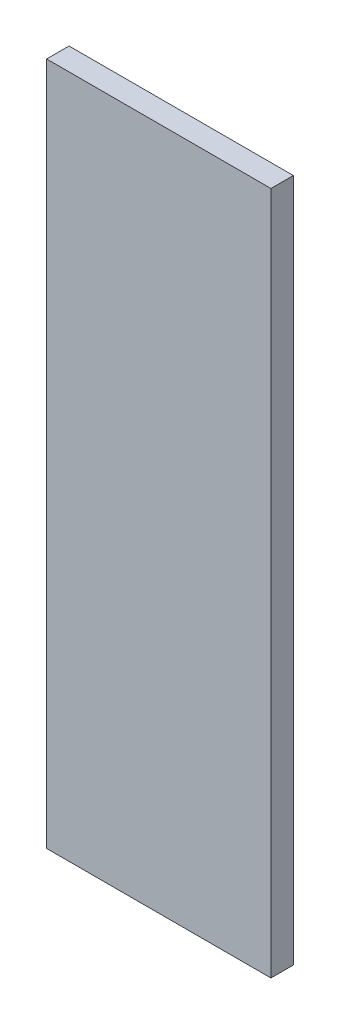
ISO-10303-21;
HEADER;
FILE_DESCRIPTION(('STEP AP214'),'2;1');
FILE_NAME('part.step','',(''),(''),'','','');
FILE_SCHEMA(('AUTOMOTIVE_DESIGN { 1 0 10303 214 1 1 1 1 }'));
ENDSEC;
DATA;
#1=APPLICATION_CONTEXT('core data for automotive mechanical design processes');
#2=APPLICATION_PROTOCOL_DEFINITION('international standard','automotive_design',2000,#1);
#3=PRODUCT_CONTEXT('',#1,'mechanical');
#4=PRODUCT('Part','Part','',(#3));
#5=PRODUCT_RELATED_PRODUCT_CATEGORY('part','',(#4));
#6=PRODUCT_DEFINITION_FORMATION('','',#4);
#7=PRODUCT_DEFINITION_CONTEXT('part definition',#1,'design');
#8=PRODUCT_DEFINITION('design','',#6,#7);
#9=PRODUCT_DEFINITION_SHAPE('','',#8);
#10=(LENGTH_UNIT() NAMED_UNIT(*) SI_UNIT(.MILLI.,.METRE.));
#11=(NAMED_UNIT(*) PLANE_ANGLE_UNIT() SI_UNIT($,.RADIAN.));
#12=(NAMED_UNIT(*) SI_UNIT($,.STERADIAN.) SOLID_ANGLE_UNIT());
#13=UNCERTAINTY_MEASURE_WITH_UNIT(LENGTH_MEASURE(1.E-05),#10,'distance_accuracy_value','');
#14=(GEOMETRIC_REPRESENTATION_CONTEXT(3) GLOBAL_UNCERTAINTY_ASSIGNED_CONTEXT((#13)) GLOBAL_UNIT_ASSIGNED_CONTEXT((#10,
#11,#12)) REPRESENTATION_CONTEXT('',''));
#15=CARTESIAN_POINT('',(0.,0.,0.));
#16=DIRECTION('',(0.,0.,1.));
#17=DIRECTION('',(1.,0.,0.));
#18=AXIS2_PLACEMENT_3D('',#15,#16,#17);
#19=CARTESIAN_POINT('',(0.,0.,10.));
#20=DIRECTION('',(1.,0.,0.));
#21=DIRECTION('',(0.,0.,-1.));
#22=AXIS2_PLACEMENT_3D('',#19,#20,#21);
#23=PLANE('',#22);
#24=DIRECTION('',(0.,-1.,0.));
#25=VECTOR('',#24,1.);
#26=CARTESIAN_POINT('',(0.,0.,0.));
#27=LINE('',#26,#25);
#28=CARTESIAN_POINT('',(0.,304.8,0.));
#29=VERTEX_POINT('',#28);
#30=CARTESIAN_POINT('',(0.,0.,0.));
#31=VERTEX_POINT('',#30);
#32=EDGE_CURVE('E96',#29,#31,#27,.T.);
#33=ORIENTED_EDGE('',*,*,#32,.T.);
#34=DIRECTION('',(0.,0.,-1.));
#35=VECTOR('',#34,1.);
#36=CARTESIAN_POINT('',(0.,0.,10.));
#37=LINE('',#36,#35);
#38=CARTESIAN_POINT('',(0.,0.,10.));
#39=VERTEX_POINT('',#38);
#40=EDGE_CURVE('E11',#39,#31,#37,.T.);
#41=ORIENTED_EDGE('',*,*,#40,.F.);
#42=DIRECTION('',(0.,-1.,0.));
#43=VECTOR('',#42,1.);
#44=CARTESIAN_POINT('',(0.,0.,10.));
#45=LINE('',#44,#43);
#46=CARTESIAN_POINT('',(0.,304.8,10.));
#47=VERTEX_POINT('',#46);
#48=EDGE_CURVE('E84',#47,#39,#45,.T.);
#49=ORIENTED_EDGE('',*,*,#48,.F.);
#50=DIRECTION('',(0.,0.,-1.));
#51=VECTOR('',#50,1.);
#52=CARTESIAN_POINT('',(0.,304.8,10.));
#53=LINE('',#52,#51);
#54=EDGE_CURVE('E92',#47,#29,#53,.T.);
#55=ORIENTED_EDGE('',*,*,#54,.T.);
#56=EDGE_LOOP('',(#33,#41,#49,#55));
#57=FACE_BOUND('',#56,.T.);
#58=ADVANCED_FACE('F33',(#57),#23,.F.);
#59=CARTESIAN_POINT('',(0.,0.,10.));
#60=DIRECTION('',(0.,1.,0.));
#61=DIRECTION('',(0.,0.,1.));
#62=AXIS2_PLACEMENT_3D('',#59,#60,#61);
#63=PLANE('',#62);
#64=DIRECTION('',(1.,0.,0.));
#65=VECTOR('',#64,1.);
#66=CARTESIAN_POINT('',(0.,0.,0.));
#67=LINE('',#66,#65);
#68=CARTESIAN_POINT('',(100.,0.,0.));
#69=VERTEX_POINT('',#68);
#70=EDGE_CURVE('E88',#31,#69,#67,.T.);
#71=ORIENTED_EDGE('',*,*,#70,.T.);
#72=DIRECTION('',(0.,0.,-1.));
#73=VECTOR('',#72,1.);
#74=CARTESIAN_POINT('',(100.,0.,10.));
#75=LINE('',#74,#73);
#76=CARTESIAN_POINT('',(100.,0.,10.));
#77=VERTEX_POINT('',#76);
#78=EDGE_CURVE('E41',#77,#69,#75,.T.);
#79=ORIENTED_EDGE('',*,*,#78,.F.);
#80=DIRECTION('',(1.,0.,0.));
#81=VECTOR('',#80,1.);
#82=CARTESIAN_POINT('',(0.,0.,10.));
#83=LINE('',#82,#81);
#84=EDGE_CURVE('E79',#39,#77,#83,.T.);
#85=ORIENTED_EDGE('',*,*,#84,.F.);
#86=ORIENTED_EDGE('',*,*,#40,.T.);
#87=EDGE_LOOP('',(#71,#79,#85,#86));
#88=FACE_BOUND('',#87,.T.);
#89=ADVANCED_FACE('F87',(#88),#63,.F.);
#90=CARTESIAN_POINT('',(100.,0.,10.));
#91=DIRECTION('',(-1.,0.,0.));
#92=DIRECTION('',(0.,0.,1.));
#93=AXIS2_PLACEMENT_3D('',#90,#91,#92);
#94=PLANE('',#93);
#95=DIRECTION('',(0.,1.,0.));
#96=VECTOR('',#95,1.);
#97=CARTESIAN_POINT('',(100.,0.,0.));
#98=LINE('',#97,#96);
#99=CARTESIAN_POINT('',(100.,304.8,0.));
#100=VERTEX_POINT('',#99);
#101=EDGE_CURVE('E66',#69,#100,#98,.T.);
#102=ORIENTED_EDGE('',*,*,#101,.T.);
#103=DIRECTION('',(0.,0.,-1.));
#104=VECTOR('',#103,1.);
#105=CARTESIAN_POINT('',(100.,304.8,10.));
#106=LINE('',#105,#104);
#107=CARTESIAN_POINT('',(100.,304.8,10.));
#108=VERTEX_POINT('',#107);
#109=EDGE_CURVE('E89',#108,#100,#106,.T.);
#110=ORIENTED_EDGE('',*,*,#109,.F.);
#111=DIRECTION('',(0.,1.,0.));
#112=VECTOR('',#111,1.);
#113=CARTESIAN_POINT('',(100.,0.,10.));
#114=LINE('',#113,#112);
#115=EDGE_CURVE('E82',#77,#108,#114,.T.);
#116=ORIENTED_EDGE('',*,*,#115,.F.);
#117=ORIENTED_EDGE('',*,*,#78,.T.);
#118=EDGE_LOOP('',(#102,#110,#116,#117));
#119=FACE_BOUND('',#118,.T.);
#120=ADVANCED_FACE('F90',(#119),#94,.F.);
#121=CARTESIAN_POINT('',(0.,304.8,10.));
#122=DIRECTION('',(0.,-1.,0.));
#123=DIRECTION('',(0.,0.,-1.));
#124=AXIS2_PLACEMENT_3D('',#121,#122,#123);
#125=PLANE('',#124);
#126=DIRECTION('',(-1.,0.,0.));
#127=VECTOR('',#126,1.);
#128=CARTESIAN_POINT('',(0.,304.8,0.));
#129=LINE('',#128,#127);
#130=EDGE_CURVE('E72',#100,#29,#129,.T.);
#131=ORIENTED_EDGE('',*,*,#130,.T.);
#132=ORIENTED_EDGE('',*,*,#54,.F.);
#133=DIRECTION('',(-1.,0.,0.));
#134=VECTOR('',#133,1.);
#135=CARTESIAN_POINT('',(0.,304.8,10.));
#136=LINE('',#135,#134);
#137=EDGE_CURVE('E49',#108,#47,#136,.T.);
#138=ORIENTED_EDGE('',*,*,#137,.F.);
#139=ORIENTED_EDGE('',*,*,#109,.T.);
#140=EDGE_LOOP('',(#131,#132,#138,#139));
#141=FACE_BOUND('',#140,.T.);
#142=ADVANCED_FACE('F103',(#141),#125,.F.);
#143=CARTESIAN_POINT('',(0.,0.,10.));
#144=DIRECTION('',(0.,0.,-1.));
#145=DIRECTION('',(-1.,0.,0.));
#146=AXIS2_PLACEMENT_3D('',#143,#144,#145);
#147=PLANE('',#146);
#148=ORIENTED_EDGE('',*,*,#48,.T.);
#149=ORIENTED_EDGE('',*,*,#84,.T.);
#150=ORIENTED_EDGE('',*,*,#115,.T.);
#151=ORIENTED_EDGE('',*,*,#137,.T.);
#152=EDGE_LOOP('',(#148,#149,#150,#151));
#153=FACE_BOUND('',#152,.T.);
#154=ADVANCED_FACE('F80',(#153),#147,.F.);
#155=CARTESIAN_POINT('',(0.,0.,0.));
#156=DIRECTION('',(0.,0.,-1.));
#157=DIRECTION('',(-1.,0.,0.));
#158=AXIS2_PLACEMENT_3D('',#155,#156,#157);
#159=PLANE('',#158);
#160=ORIENTED_EDGE('',*,*,#32,.F.);
#161=ORIENTED_EDGE('',*,*,#130,.F.);
#162=ORIENTED_EDGE('',*,*,#101,.F.);
#163=ORIENTED_EDGE('',*,*,#70,.F.);
#164=EDGE_LOOP('',(#160,#161,#162,#163));
#165=FACE_BOUND('',#164,.T.);
#166=ADVANCED_FACE('F106',(#165),#159,.T.);
#167=CLOSED_SHELL('',(#58,#89,#120,#142,#154,#166));
#168=MANIFOLD_SOLID_BREP('B2',#167);
#169=ADVANCED_BREP_SHAPE_REPRESENTATION('',(#18,#168),#14);
#170=SHAPE_DEFINITION_REPRESENTATION(#9,#169);
ENDSEC;
END-ISO-10303-21;
